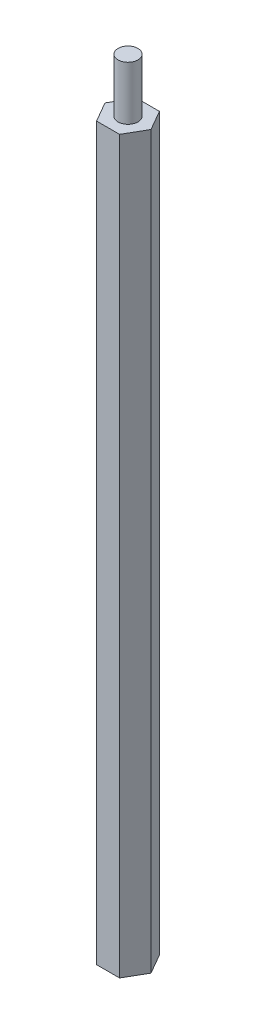
ISO-10303-21;
HEADER;
FILE_DESCRIPTION(('STEP AP214'),'2;1');
FILE_NAME('part.step','',(''),(''),'','','');
FILE_SCHEMA(('AUTOMOTIVE_DESIGN { 1 0 10303 214 1 1 1 1 }'));
ENDSEC;
DATA;
#1=APPLICATION_CONTEXT('core data for automotive mechanical design processes');
#2=APPLICATION_PROTOCOL_DEFINITION('international standard','automotive_design',2000,#1);
#3=PRODUCT_CONTEXT('',#1,'mechanical');
#4=PRODUCT('Part','Part','',(#3));
#5=PRODUCT_RELATED_PRODUCT_CATEGORY('part','',(#4));
#6=PRODUCT_DEFINITION_FORMATION('','',#4);
#7=PRODUCT_DEFINITION_CONTEXT('part definition',#1,'design');
#8=PRODUCT_DEFINITION('design','',#6,#7);
#9=PRODUCT_DEFINITION_SHAPE('','',#8);
#10=(LENGTH_UNIT() NAMED_UNIT(*) SI_UNIT(.MILLI.,.METRE.));
#11=(NAMED_UNIT(*) PLANE_ANGLE_UNIT() SI_UNIT($,.RADIAN.));
#12=(NAMED_UNIT(*) SI_UNIT($,.STERADIAN.) SOLID_ANGLE_UNIT());
#13=UNCERTAINTY_MEASURE_WITH_UNIT(LENGTH_MEASURE(1.E-05),#10,'distance_accuracy_value','');
#14=(GEOMETRIC_REPRESENTATION_CONTEXT(3) GLOBAL_UNCERTAINTY_ASSIGNED_CONTEXT((#13)) GLOBAL_UNIT_ASSIGNED_CONTEXT((#10,
#11,#12)) REPRESENTATION_CONTEXT('',''));
#15=CARTESIAN_POINT('',(0.,0.,0.));
#16=DIRECTION('',(0.,0.,1.));
#17=DIRECTION('',(1.,0.,0.));
#18=AXIS2_PLACEMENT_3D('',#15,#16,#17);
#19=CARTESIAN_POINT('',(-1.73205080756888,110.,-3.));
#20=DIRECTION('',(0.866025403784439,0.,0.5));
#21=DIRECTION('',(0.5,0.,-0.866025403784438));
#22=AXIS2_PLACEMENT_3D('',#19,#20,#21);
#23=PLANE('',#22);
#24=DIRECTION('',(-0.5,0.,0.866025403784439));
#25=VECTOR('',#24,1.);
#26=CARTESIAN_POINT('',(-1.73205080756888,0.,-3.));
#27=LINE('',#26,#25);
#28=CARTESIAN_POINT('',(-1.73205080756888,0.,-3.));
#29=VERTEX_POINT('',#28);
#30=CARTESIAN_POINT('',(-3.46410161513775,0.,0.));
#31=VERTEX_POINT('',#30);
#32=EDGE_CURVE('E123',#29,#31,#27,.T.);
#33=ORIENTED_EDGE('',*,*,#32,.T.);
#34=DIRECTION('',(0.,-1.,0.));
#35=VECTOR('',#34,1.);
#36=CARTESIAN_POINT('',(-3.46410161513775,110.,0.));
#37=LINE('',#36,#35);
#38=CARTESIAN_POINT('',(-3.46410161513775,110.,0.));
#39=VERTEX_POINT('',#38);
#40=EDGE_CURVE('E40',#39,#31,#37,.T.);
#41=ORIENTED_EDGE('',*,*,#40,.F.);
#42=DIRECTION('',(-0.5,0.,0.866025403784439));
#43=VECTOR('',#42,1.);
#44=CARTESIAN_POINT('',(-1.73205080756888,110.,-3.));
#45=LINE('',#44,#43);
#46=CARTESIAN_POINT('',(-1.73205080756888,110.,-3.));
#47=VERTEX_POINT('',#46);
#48=EDGE_CURVE('E134',#47,#39,#45,.T.);
#49=ORIENTED_EDGE('',*,*,#48,.F.);
#50=DIRECTION('',(0.,-1.,0.));
#51=VECTOR('',#50,1.);
#52=CARTESIAN_POINT('',(-1.73205080756888,110.,-3.));
#53=LINE('',#52,#51);
#54=EDGE_CURVE('E119',#47,#29,#53,.T.);
#55=ORIENTED_EDGE('',*,*,#54,.T.);
#56=EDGE_LOOP('',(#33,#41,#49,#55));
#57=FACE_BOUND('',#56,.T.);
#58=ADVANCED_FACE('F37',(#57),#23,.F.);
#59=CARTESIAN_POINT('',(-3.46410161513775,110.,0.));
#60=DIRECTION('',(0.866025403784439,0.,-0.5));
#61=DIRECTION('',(-0.5,0.,-0.866025403784439));
#62=AXIS2_PLACEMENT_3D('',#59,#60,#61);
#63=PLANE('',#62);
#64=DIRECTION('',(0.5,0.,0.866025403784439));
#65=VECTOR('',#64,1.);
#66=CARTESIAN_POINT('',(-3.46410161513775,0.,0.));
#67=LINE('',#66,#65);
#68=CARTESIAN_POINT('',(-1.73205080756888,0.,3.));
#69=VERTEX_POINT('',#68);
#70=EDGE_CURVE('E126',#31,#69,#67,.T.);
#71=ORIENTED_EDGE('',*,*,#70,.T.);
#72=DIRECTION('',(0.,-1.,0.));
#73=VECTOR('',#72,1.);
#74=CARTESIAN_POINT('',(-1.73205080756888,110.,3.));
#75=LINE('',#74,#73);
#76=CARTESIAN_POINT('',(-1.73205080756888,110.,3.));
#77=VERTEX_POINT('',#76);
#78=EDGE_CURVE('E137',#77,#69,#75,.T.);
#79=ORIENTED_EDGE('',*,*,#78,.F.);
#80=DIRECTION('',(0.5,0.,0.866025403784439));
#81=VECTOR('',#80,1.);
#82=CARTESIAN_POINT('',(-3.46410161513775,110.,0.));
#83=LINE('',#82,#81);
#84=EDGE_CURVE('E92',#39,#77,#83,.T.);
#85=ORIENTED_EDGE('',*,*,#84,.F.);
#86=ORIENTED_EDGE('',*,*,#40,.T.);
#87=EDGE_LOOP('',(#71,#79,#85,#86));
#88=FACE_BOUND('',#87,.T.);
#89=ADVANCED_FACE('F142',(#88),#63,.F.);
#90=CARTESIAN_POINT('',(-1.73205080756888,110.,3.));
#91=DIRECTION('',(0.,0.,-1.));
#92=DIRECTION('',(-1.,0.,0.));
#93=AXIS2_PLACEMENT_3D('',#90,#91,#92);
#94=PLANE('',#93);
#95=DIRECTION('',(1.,0.,0.));
#96=VECTOR('',#95,1.);
#97=CARTESIAN_POINT('',(-1.73205080756888,0.,3.));
#98=LINE('',#97,#96);
#99=CARTESIAN_POINT('',(1.73205080756888,0.,3.));
#100=VERTEX_POINT('',#99);
#101=EDGE_CURVE('E129',#69,#100,#98,.T.);
#102=ORIENTED_EDGE('',*,*,#101,.T.);
#103=DIRECTION('',(0.,-1.,0.));
#104=VECTOR('',#103,1.);
#105=CARTESIAN_POINT('',(1.73205080756888,110.,3.));
#106=LINE('',#105,#104);
#107=CARTESIAN_POINT('',(1.73205080756888,110.,3.));
#108=VERTEX_POINT('',#107);
#109=EDGE_CURVE('E114',#108,#100,#106,.T.);
#110=ORIENTED_EDGE('',*,*,#109,.F.);
#111=DIRECTION('',(1.,0.,0.));
#112=VECTOR('',#111,1.);
#113=CARTESIAN_POINT('',(-1.73205080756888,110.,3.));
#114=LINE('',#113,#112);
#115=EDGE_CURVE('E105',#77,#108,#114,.T.);
#116=ORIENTED_EDGE('',*,*,#115,.F.);
#117=ORIENTED_EDGE('',*,*,#78,.T.);
#118=EDGE_LOOP('',(#102,#110,#116,#117));
#119=FACE_BOUND('',#118,.T.);
#120=ADVANCED_FACE('F148',(#119),#94,.F.);
#121=CARTESIAN_POINT('',(1.73205080756888,110.,3.));
#122=DIRECTION('',(-0.866025403784439,0.,-0.5));
#123=DIRECTION('',(-0.5,0.,0.866025403784439));
#124=AXIS2_PLACEMENT_3D('',#121,#122,#123);
#125=PLANE('',#124);
#126=DIRECTION('',(0.5,0.,-0.866025403784439));
#127=VECTOR('',#126,1.);
#128=CARTESIAN_POINT('',(1.73205080756888,0.,3.));
#129=LINE('',#128,#127);
#130=CARTESIAN_POINT('',(3.46410161513775,0.,0.));
#131=VERTEX_POINT('',#130);
#132=EDGE_CURVE('E113',#100,#131,#129,.T.);
#133=ORIENTED_EDGE('',*,*,#132,.T.);
#134=DIRECTION('',(0.,-1.,0.));
#135=VECTOR('',#134,1.);
#136=CARTESIAN_POINT('',(3.46410161513775,110.,0.));
#137=LINE('',#136,#135);
#138=CARTESIAN_POINT('',(3.46410161513775,110.,0.));
#139=VERTEX_POINT('',#138);
#140=EDGE_CURVE('E110',#139,#131,#137,.T.);
#141=ORIENTED_EDGE('',*,*,#140,.F.);
#142=DIRECTION('',(0.5,0.,-0.866025403784439));
#143=VECTOR('',#142,1.);
#144=CARTESIAN_POINT('',(1.73205080756888,110.,3.));
#145=LINE('',#144,#143);
#146=EDGE_CURVE('E99',#108,#139,#145,.T.);
#147=ORIENTED_EDGE('',*,*,#146,.F.);
#148=ORIENTED_EDGE('',*,*,#109,.T.);
#149=EDGE_LOOP('',(#133,#141,#147,#148));
#150=FACE_BOUND('',#149,.T.);
#151=ADVANCED_FACE('F111',(#150),#125,.F.);
#152=CARTESIAN_POINT('',(3.46410161513775,110.,0.));
#153=DIRECTION('',(-0.866025403784439,0.,0.5));
#154=DIRECTION('',(0.5,0.,0.866025403784439));
#155=AXIS2_PLACEMENT_3D('',#152,#153,#154);
#156=PLANE('',#155);
#157=DIRECTION('',(-0.5,0.,-0.866025403784439));
#158=VECTOR('',#157,1.);
#159=CARTESIAN_POINT('',(3.46410161513775,0.,0.));
#160=LINE('',#159,#158);
#161=CARTESIAN_POINT('',(1.73205080756888,0.,-3.));
#162=VERTEX_POINT('',#161);
#163=EDGE_CURVE('E77',#131,#162,#160,.T.);
#164=ORIENTED_EDGE('',*,*,#163,.T.);
#165=DIRECTION('',(0.,-1.,0.));
#166=VECTOR('',#165,1.);
#167=CARTESIAN_POINT('',(1.73205080756888,110.,-3.));
#168=LINE('',#167,#166);
#169=CARTESIAN_POINT('',(1.73205080756888,110.,-3.));
#170=VERTEX_POINT('',#169);
#171=EDGE_CURVE('E115',#170,#162,#168,.T.);
#172=ORIENTED_EDGE('',*,*,#171,.F.);
#173=DIRECTION('',(-0.5,0.,-0.866025403784439));
#174=VECTOR('',#173,1.);
#175=CARTESIAN_POINT('',(3.46410161513775,110.,0.));
#176=LINE('',#175,#174);
#177=EDGE_CURVE('E103',#139,#170,#176,.T.);
#178=ORIENTED_EDGE('',*,*,#177,.F.);
#179=ORIENTED_EDGE('',*,*,#140,.T.);
#180=EDGE_LOOP('',(#164,#172,#178,#179));
#181=FACE_BOUND('',#180,.T.);
#182=ADVANCED_FACE('F117',(#181),#156,.F.);
#183=CARTESIAN_POINT('',(1.73205080756888,110.,-3.));
#184=DIRECTION('',(0.,0.,1.));
#185=DIRECTION('',(1.,0.,0.));
#186=AXIS2_PLACEMENT_3D('',#183,#184,#185);
#187=PLANE('',#186);
#188=DIRECTION('',(-1.,0.,0.));
#189=VECTOR('',#188,1.);
#190=CARTESIAN_POINT('',(1.73205080756888,0.,-3.));
#191=LINE('',#190,#189);
#192=EDGE_CURVE('E83',#162,#29,#191,.T.);
#193=ORIENTED_EDGE('',*,*,#192,.T.);
#194=ORIENTED_EDGE('',*,*,#54,.F.);
#195=DIRECTION('',(-1.,0.,0.));
#196=VECTOR('',#195,1.);
#197=CARTESIAN_POINT('',(1.73205080756888,110.,-3.));
#198=LINE('',#197,#196);
#199=EDGE_CURVE('E54',#170,#47,#198,.T.);
#200=ORIENTED_EDGE('',*,*,#199,.F.);
#201=ORIENTED_EDGE('',*,*,#171,.T.);
#202=EDGE_LOOP('',(#193,#194,#200,#201));
#203=FACE_BOUND('',#202,.T.);
#204=ADVANCED_FACE('F179',(#203),#187,.F.);
#205=CARTESIAN_POINT('',(0.,110.,0.));
#206=DIRECTION('',(0.,1.,0.));
#207=DIRECTION('',(0.,0.,1.));
#208=AXIS2_PLACEMENT_3D('',#205,#206,#207);
#209=PLANE('',#208);
#210=CARTESIAN_POINT('',(0.,110.,0.));
#211=DIRECTION('',(0.,1.,0.));
#212=DIRECTION('',(0.,0.,1.));
#213=AXIS2_PLACEMENT_3D('',#210,#211,#212);
#214=CIRCLE('',#213,1.5);
#215=CARTESIAN_POINT('',(0.,110.,1.5));
#216=VERTEX_POINT('',#215);
#217=EDGE_CURVE('E11',#216,#216,#214,.T.);
#218=ORIENTED_EDGE('',*,*,#217,.F.);
#219=EDGE_LOOP('',(#218));
#220=FACE_BOUND('',#219,.T.);
#221=ORIENTED_EDGE('',*,*,#48,.T.);
#222=ORIENTED_EDGE('',*,*,#84,.T.);
#223=ORIENTED_EDGE('',*,*,#115,.T.);
#224=ORIENTED_EDGE('',*,*,#146,.T.);
#225=ORIENTED_EDGE('',*,*,#177,.T.);
#226=ORIENTED_EDGE('',*,*,#199,.T.);
#227=EDGE_LOOP('',(#221,#222,#223,#224,#225,#226));
#228=FACE_BOUND('',#227,.T.);
#229=ADVANCED_FACE('F101',(#220,#228),#209,.T.);
#230=CARTESIAN_POINT('',(0.,0.,0.));
#231=DIRECTION('',(0.,1.,0.));
#232=DIRECTION('',(0.,0.,1.));
#233=AXIS2_PLACEMENT_3D('',#230,#231,#232);
#234=PLANE('',#233);
#235=CARTESIAN_POINT('',(0.,0.,0.));
#236=DIRECTION('',(0.,-1.,0.));
#237=DIRECTION('',(0.,0.,-1.));
#238=AXIS2_PLACEMENT_3D('',#235,#236,#237);
#239=CIRCLE('',#238,1.5);
#240=CARTESIAN_POINT('',(0.,0.,-1.5));
#241=VERTEX_POINT('',#240);
#242=EDGE_CURVE('E155',#241,#241,#239,.T.);
#243=ORIENTED_EDGE('',*,*,#242,.F.);
#244=EDGE_LOOP('',(#243));
#245=FACE_BOUND('',#244,.T.);
#246=ORIENTED_EDGE('',*,*,#32,.F.);
#247=ORIENTED_EDGE('',*,*,#192,.F.);
#248=ORIENTED_EDGE('',*,*,#163,.F.);
#249=ORIENTED_EDGE('',*,*,#132,.F.);
#250=ORIENTED_EDGE('',*,*,#101,.F.);
#251=ORIENTED_EDGE('',*,*,#70,.F.);
#252=EDGE_LOOP('',(#246,#247,#248,#249,#250,#251));
#253=FACE_BOUND('',#252,.T.);
#254=ADVANCED_FACE('F147',(#245,#253),#234,.F.);
#255=CARTESIAN_POINT('',(0.,118.091605470966,0.));
#256=DIRECTION('',(0.,-1.,0.));
#257=DIRECTION('',(0.,0.,-1.));
#258=AXIS2_PLACEMENT_3D('',#255,#256,#257);
#259=CYLINDRICAL_SURFACE('',#258,1.5);
#260=CARTESIAN_POINT('',(0.,118.091605470966,0.));
#261=DIRECTION('',(0.,1.,0.));
#262=DIRECTION('',(0.,0.,1.));
#263=AXIS2_PLACEMENT_3D('',#260,#261,#262);
#264=CIRCLE('',#263,1.5);
#265=CARTESIAN_POINT('',(0.,118.091605470966,1.5));
#266=VERTEX_POINT('',#265);
#267=EDGE_CURVE('E127',#266,#266,#264,.T.);
#268=ORIENTED_EDGE('',*,*,#267,.F.);
#269=EDGE_LOOP('',(#268));
#270=FACE_BOUND('',#269,.T.);
#271=ORIENTED_EDGE('',*,*,#217,.T.);
#272=EDGE_LOOP('',(#271));
#273=FACE_BOUND('',#272,.T.);
#274=ADVANCED_FACE('F171',(#270,#273),#259,.T.);
#275=CARTESIAN_POINT('',(0.,118.091605470966,0.));
#276=DIRECTION('',(0.,1.,0.));
#277=DIRECTION('',(0.,0.,1.));
#278=AXIS2_PLACEMENT_3D('',#275,#276,#277);
#279=PLANE('',#278);
#280=ORIENTED_EDGE('',*,*,#267,.T.);
#281=EDGE_LOOP('',(#280));
#282=FACE_BOUND('',#281,.T.);
#283=ADVANCED_FACE('F166',(#282),#279,.T.);
#284=CARTESIAN_POINT('',(0.,4.,0.));
#285=DIRECTION('',(0.,-1.,0.));
#286=DIRECTION('',(0.,0.,-1.));
#287=AXIS2_PLACEMENT_3D('',#284,#285,#286);
#288=CYLINDRICAL_SURFACE('',#287,1.5);
#289=CARTESIAN_POINT('',(0.,4.,0.));
#290=DIRECTION('',(0.,-1.,0.));
#291=DIRECTION('',(0.,0.,-1.));
#292=AXIS2_PLACEMENT_3D('',#289,#290,#291);
#293=CIRCLE('',#292,1.5);
#294=CARTESIAN_POINT('',(0.,4.,-1.5));
#295=VERTEX_POINT('',#294);
#296=EDGE_CURVE('E154',#295,#295,#293,.T.);
#297=ORIENTED_EDGE('',*,*,#296,.F.);
#298=EDGE_LOOP('',(#297));
#299=FACE_BOUND('',#298,.T.);
#300=ORIENTED_EDGE('',*,*,#242,.T.);
#301=EDGE_LOOP('',(#300));
#302=FACE_BOUND('',#301,.T.);
#303=ADVANCED_FACE('F163',(#299,#302),#288,.F.);
#304=CARTESIAN_POINT('',(0.,4.,0.));
#305=DIRECTION('',(0.,-1.,0.));
#306=DIRECTION('',(0.,0.,-1.));
#307=AXIS2_PLACEMENT_3D('',#304,#305,#306);
#308=PLANE('',#307);
#309=ORIENTED_EDGE('',*,*,#296,.T.);
#310=EDGE_LOOP('',(#309));
#311=FACE_BOUND('',#310,.T.);
#312=ADVANCED_FACE('F161',(#311),#308,.T.);
#313=CLOSED_SHELL('',(#58,#89,#120,#151,#182,#204,#229,#254,#274,#283,#303,#312));
#314=MANIFOLD_SOLID_BREP('B2',#313);
#315=ADVANCED_BREP_SHAPE_REPRESENTATION('',(#18,#314),#14);
#316=SHAPE_DEFINITION_REPRESENTATION(#9,#315);
ENDSEC;
END-ISO-10303-21;
